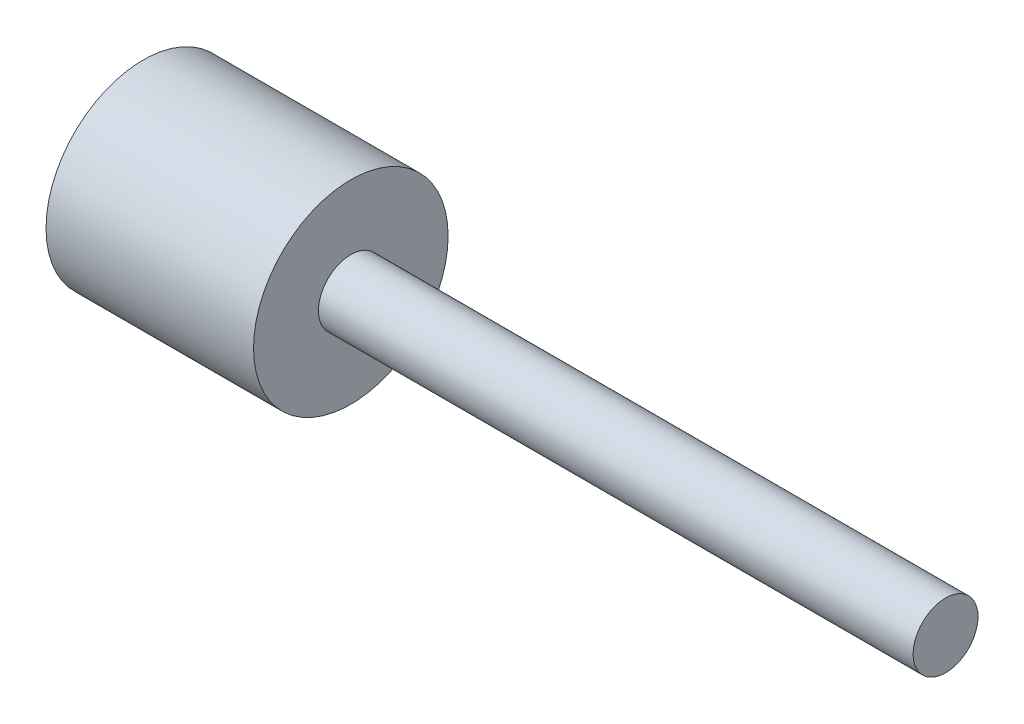
ISO-10303-21;
HEADER;
FILE_DESCRIPTION(('STEP AP214'),'2;1');
FILE_NAME('part.step','',(''),(''),'','','');
FILE_SCHEMA(('AUTOMOTIVE_DESIGN { 1 0 10303 214 1 1 1 1 }'));
ENDSEC;
DATA;
#1=APPLICATION_CONTEXT('core data for automotive mechanical design processes');
#2=APPLICATION_PROTOCOL_DEFINITION('international standard','automotive_design',2000,#1);
#3=PRODUCT_CONTEXT('',#1,'mechanical');
#4=PRODUCT('Part','Part','',(#3));
#5=PRODUCT_RELATED_PRODUCT_CATEGORY('part','',(#4));
#6=PRODUCT_DEFINITION_FORMATION('','',#4);
#7=PRODUCT_DEFINITION_CONTEXT('part definition',#1,'design');
#8=PRODUCT_DEFINITION('design','',#6,#7);
#9=PRODUCT_DEFINITION_SHAPE('','',#8);
#10=(LENGTH_UNIT() NAMED_UNIT(*) SI_UNIT(.MILLI.,.METRE.));
#11=(NAMED_UNIT(*) PLANE_ANGLE_UNIT() SI_UNIT($,.RADIAN.));
#12=(NAMED_UNIT(*) SI_UNIT($,.STERADIAN.) SOLID_ANGLE_UNIT());
#13=UNCERTAINTY_MEASURE_WITH_UNIT(LENGTH_MEASURE(1.E-05),#10,'distance_accuracy_value','');
#14=(GEOMETRIC_REPRESENTATION_CONTEXT(3) GLOBAL_UNCERTAINTY_ASSIGNED_CONTEXT((#13)) GLOBAL_UNIT_ASSIGNED_CONTEXT((#10,
#11,#12)) REPRESENTATION_CONTEXT('',''));
#15=CARTESIAN_POINT('',(0.,0.,0.));
#16=DIRECTION('',(0.,0.,1.));
#17=DIRECTION('',(1.,0.,0.));
#18=AXIS2_PLACEMENT_3D('',#15,#16,#17);
#19=CARTESIAN_POINT('',(16.,0.,0.));
#20=DIRECTION('',(-1.,0.,0.));
#21=DIRECTION('',(0.,0.,1.));
#22=AXIS2_PLACEMENT_3D('',#19,#20,#21);
#23=CYLINDRICAL_SURFACE('',#22,7.5);
#24=CARTESIAN_POINT('',(5.,-7.34846922834953,1.5));
#25=CARTESIAN_POINT('',(4.91665343676424,-7.34847088538349,1.49999691881235));
#26=CARTESIAN_POINT('',(4.83326806500025,-7.34990262402618,1.49302975757707));
#27=CARTESIAN_POINT('',(4.66885624228504,-7.35546646957746,1.46536842537441));
#28=CARTESIAN_POINT('',(4.58783173304596,-7.35960073717297,1.44466327060578));
#29=CARTESIAN_POINT('',(4.43054404496875,-7.37008310582665,1.39019367392958));
#30=CARTESIAN_POINT('',(4.35427621770114,-7.37642900431582,1.35644222122892));
#31=CARTESIAN_POINT('',(4.20848773295455,-7.39061699221019,1.27687366150577));
#32=CARTESIAN_POINT('',(4.13896669919314,-7.398458998102,1.23105722790173));
#33=CARTESIAN_POINT('',(4.00765849421921,-7.4148794954137,1.12796861348015));
#34=CARTESIAN_POINT('',(3.94598061817404,-7.42346606755867,1.07055848386998));
#35=CARTESIAN_POINT('',(3.83306369963153,-7.440337084539,0.946210183531966));
#36=CARTESIAN_POINT('',(3.78182538887421,-7.44862150816248,0.879271345466977));
#37=CARTESIAN_POINT('',(3.69081797355731,-7.46404194626342,0.737042033886384));
#38=CARTESIAN_POINT('',(3.65115272927504,-7.47116732162326,0.661683851508316));
#39=CARTESIAN_POINT('',(3.5850875944278,-7.48337605325447,0.505206225580907));
#40=CARTESIAN_POINT('',(3.55868646214851,-7.48845960066179,0.42408732213083));
#41=CARTESIAN_POINT('',(3.52023920957056,-7.49595481032628,0.259525159917742));
#42=CARTESIAN_POINT('',(3.50800853364349,-7.4984007943219,0.176126608822221));
#43=CARTESIAN_POINT('',(3.49767357224253,-7.50046381775405,0.00842785265630496));
#44=CARTESIAN_POINT('',(3.49956792553127,-7.50008112979138,-0.0758722647477643));
#45=CARTESIAN_POINT('',(3.51728927032333,-7.49655652302773,-0.241713001115383));
#46=CARTESIAN_POINT('',(3.53291746575177,-7.49345397548757,-0.323275821447705));
#47=CARTESIAN_POINT('',(3.57734754868834,-7.48488265739113,-0.482597439870451));
#48=CARTESIAN_POINT('',(3.60614996328781,-7.47941379216059,-0.560356085620693));
#49=CARTESIAN_POINT('',(3.6762950602209,-7.46665944029938,-0.71042919480133));
#50=CARTESIAN_POINT('',(3.71771562665733,-7.45936272262835,-0.78270626120085));
#51=CARTESIAN_POINT('',(3.8118636158549,-7.44375704210678,-0.919357568789634));
#52=CARTESIAN_POINT('',(3.86459233965578,-7.43544796282833,-0.983730899287501));
#53=CARTESIAN_POINT('',(3.98095043316271,-7.41856446546689,-1.10392714658019));
#54=CARTESIAN_POINT('',(4.04475378009439,-7.40998794686274,-1.15958147486045));
#55=CARTESIAN_POINT('',(4.18087466367613,-7.39367357398141,-1.25942773976521));
#56=CARTESIAN_POINT('',(4.25319236132479,-7.38593573556822,-1.30361945959163));
#57=CARTESIAN_POINT('',(4.40453124773271,-7.37217071209385,-1.37934422220282));
#58=CARTESIAN_POINT('',(4.48356645145949,-7.36614722345324,-1.41084997166656));
#59=CARTESIAN_POINT('',(4.64595698558599,-7.35654714481909,-1.46008551244137));
#60=CARTESIAN_POINT('',(4.72931175142863,-7.35297023592642,-1.47781709918496));
#61=CARTESIAN_POINT('',(4.89644728699857,-7.34873218901742,-1.49874900905408));
#62=CARTESIAN_POINT('',(4.98019636146551,-7.34802220585731,-1.50219278834687));
#63=CARTESIAN_POINT('',(5.14707233479953,-7.34946728533281,-1.49510644246611));
#64=CARTESIAN_POINT('',(5.2301992686783,-7.35162218550582,-1.48457710968366));
#65=CARTESIAN_POINT('',(5.39265296043835,-7.35850848742372,-1.45005331211123));
#66=CARTESIAN_POINT('',(5.47200851455364,-7.36321498521745,-1.42618893125895));
#67=CARTESIAN_POINT('',(5.62559491854311,-7.37465234027497,-1.36581155296278));
#68=CARTESIAN_POINT('',(5.69982534565358,-7.38138336429404,-1.32929751355976));
#69=CARTESIAN_POINT('',(5.84211966492524,-7.39622108943059,-1.2441062133234));
#70=CARTESIAN_POINT('',(5.91009056945124,-7.40434457797355,-1.19527661697413));
#71=CARTESIAN_POINT('',(6.03696246800137,-7.42100585739955,-1.08704335831907));
#72=CARTESIAN_POINT('',(6.09586252737388,-7.42954369085727,-1.02763860771681));
#73=CARTESIAN_POINT('',(6.20384383877836,-7.44623018803823,-0.898848410246836));
#74=CARTESIAN_POINT('',(6.25276048197499,-7.45437086563026,-0.829323748394444));
#75=CARTESIAN_POINT('',(6.33821882224937,-7.4692069144293,-0.682901844952133));
#76=CARTESIAN_POINT('',(6.37476103901717,-7.47590234632816,-0.60600491315026));
#77=CARTESIAN_POINT('',(6.43419330761995,-7.487059410916,-0.447454021236019));
#78=CARTESIAN_POINT('',(6.45716077733938,-7.49153368713906,-0.365830010217117));
#79=CARTESIAN_POINT('',(6.48903687149577,-7.4977985390649,-0.199784182019869));
#80=CARTESIAN_POINT('',(6.49794718921352,-7.49958943799765,-0.115362703066822));
#81=CARTESIAN_POINT('',(6.50139047144433,-7.50027810681181,0.0523093408554342));
#82=CARTESIAN_POINT('',(6.49617092068432,-7.49922567824026,0.135554718212252));
#83=CARTESIAN_POINT('',(6.47204907417828,-7.49445065340477,0.299956546973461));
#84=CARTESIAN_POINT('',(6.45314695047789,-7.49072809071528,0.381113024630536));
#85=CARTESIAN_POINT('',(6.40230651186253,-7.481032475475,0.538879124617643));
#86=CARTESIAN_POINT('',(6.37039793280322,-7.47506455871866,0.61549866486042));
#87=CARTESIAN_POINT('',(6.29448163800365,-7.46152083185077,0.762331830278928));
#88=CARTESIAN_POINT('',(6.25047296614443,-7.45394489468828,0.832544948651117));
#89=CARTESIAN_POINT('',(6.15077091940688,-7.43786398736791,0.965795835159535));
#90=CARTESIAN_POINT('',(6.09490049541984,-7.4293460013317,1.02869957417475));
#91=CARTESIAN_POINT('',(5.97342463985635,-7.41241834355477,1.14432392663527));
#92=CARTESIAN_POINT('',(5.90781690579693,-7.40400869794476,1.19704212480408));
#93=CARTESIAN_POINT('',(5.7678810249497,-7.3881501412478,1.29133832918279));
#94=CARTESIAN_POINT('',(5.69346655825931,-7.38071255446371,1.33279022195961));
#95=CARTESIAN_POINT('',(5.5386008400506,-7.36777855777287,1.40253607393175));
#96=CARTESIAN_POINT('',(5.45815514195366,-7.36228038807749,1.43084196896908));
#97=CARTESIAN_POINT('',(5.31460631684475,-7.3549452169166,1.4680037097813));
#98=CARTESIAN_POINT('',(5.25232187073151,-7.35253177367824,1.47998084778412));
#99=CARTESIAN_POINT('',(5.12669906817085,-7.34929317692711,1.49598002694097));
#100=CARTESIAN_POINT('',(5.06336074813256,-7.34846796865859,1.50000234234439));
#101=CARTESIAN_POINT('',(5.,-7.34846922834953,1.5));
#102=B_SPLINE_CURVE_WITH_KNOTS('',3,(#24,#25,#26,#27,#28,#29,#30,#31,#32,#33,#34,#35,#36,#37,
#38,#39,#40,#41,#42,#43,#44,#45,#46,#47,#48,#49,#50,#51,#52,#53,#54,#55,#56,#57,#58,#59,#60,#61,
#62,#63,#64,#65,#66,#67,#68,#69,#70,#71,#72,#73,#74,#75,#76,#77,#78,#79,#80,#81,#82,#83,#84,#85,
#86,#87,#88,#89,#90,#91,#92,#93,#94,#95,#96,#97,#98,#99,#100,#101),.UNSPECIFIED.,.T.,.F.,(4,2,2,
2,2,2,2,2,2,2,2,2,2,2,2,2,2,2,2,2,2,2,2,2,2,2,2,2,2,2,2,2,2,2,2,2,2,2,4),(0.,0.249807695804142,
0.499815358926445,0.749574746910878,0.999320197289795,1.25223378822655,1.50516510053133,
1.76030100656175,2.0154130236984,2.26716373324621,2.51889018174372,2.76703184450306,
3.01518343610625,3.26489886333455,3.51464303655099,3.76874020143725,4.0228421718408,
4.27748794759165,4.53210052524037,4.7823563670689,5.03259801792632,5.28044012674978,
5.52830265531597,5.77939589661781,6.03051499305313,6.28548902600176,6.54045234945157,
6.79394720367975,7.04741152037441,7.29646526122028,7.54551587050135,7.79400025613177,
8.04250428202026,8.29501728038395,8.54759008334671,8.80288347868561,9.05794462633398,
9.24785705455343,9.43776293526322),.UNSPECIFIED.);
#103=CARTESIAN_POINT('',(5.,-7.34846922834953,1.5));
#104=VERTEX_POINT('',#103);
#105=EDGE_CURVE('E85',#104,#104,#102,.T.);
#106=ORIENTED_EDGE('',*,*,#105,.F.);
#107=EDGE_LOOP('',(#106));
#108=FACE_BOUND('',#107,.T.);
#109=CARTESIAN_POINT('',(16.,0.,0.));
#110=DIRECTION('',(1.,0.,0.));
#111=DIRECTION('',(0.,0.,-1.));
#112=AXIS2_PLACEMENT_3D('',#109,#110,#111);
#113=CIRCLE('',#112,7.5);
#114=CARTESIAN_POINT('',(16.,0.,-7.5));
#115=VERTEX_POINT('',#114);
#116=EDGE_CURVE('E48',#115,#115,#113,.T.);
#117=ORIENTED_EDGE('',*,*,#116,.F.);
#118=EDGE_LOOP('',(#117));
#119=FACE_BOUND('',#118,.T.);
#120=CARTESIAN_POINT('',(0.,0.,0.));
#121=DIRECTION('',(1.,0.,0.));
#122=DIRECTION('',(0.,0.,-1.));
#123=AXIS2_PLACEMENT_3D('',#120,#121,#122);
#124=CIRCLE('',#123,7.5);
#125=CARTESIAN_POINT('',(0.,0.,-7.5));
#126=VERTEX_POINT('',#125);
#127=EDGE_CURVE('E42',#126,#126,#124,.T.);
#128=ORIENTED_EDGE('',*,*,#127,.T.);
#129=EDGE_LOOP('',(#128));
#130=FACE_BOUND('',#129,.T.);
#131=ADVANCED_FACE('F39',(#108,#119,#130),#23,.T.);
#132=CARTESIAN_POINT('',(16.,0.,0.));
#133=DIRECTION('',(1.,0.,0.));
#134=DIRECTION('',(0.,0.,-1.));
#135=AXIS2_PLACEMENT_3D('',#132,#133,#134);
#136=PLANE('',#135);
#137=CARTESIAN_POINT('',(16.,0.,0.));
#138=DIRECTION('',(1.,0.,0.));
#139=DIRECTION('',(0.,0.,-1.));
#140=AXIS2_PLACEMENT_3D('',#137,#138,#139);
#141=CIRCLE('',#140,2.5);
#142=CARTESIAN_POINT('',(16.,0.,-2.5));
#143=VERTEX_POINT('',#142);
#144=EDGE_CURVE('E11',#143,#143,#141,.T.);
#145=ORIENTED_EDGE('',*,*,#144,.F.);
#146=EDGE_LOOP('',(#145));
#147=FACE_BOUND('',#146,.T.);
#148=ORIENTED_EDGE('',*,*,#116,.T.);
#149=EDGE_LOOP('',(#148));
#150=FACE_BOUND('',#149,.T.);
#151=ADVANCED_FACE('F109',(#147,#150),#136,.T.);
#152=CARTESIAN_POINT('',(0.,0.,0.));
#153=DIRECTION('',(1.,0.,0.));
#154=DIRECTION('',(0.,0.,-1.));
#155=AXIS2_PLACEMENT_3D('',#152,#153,#154);
#156=PLANE('',#155);
#157=DIRECTION('',(0.,0.,1.));
#158=VECTOR('',#157,1.);
#159=CARTESIAN_POINT('',(0.,-2.5,-2.44948974278318));
#160=LINE('',#159,#158);
#161=CARTESIAN_POINT('',(0.,-2.5,-2.44948974278318));
#162=VERTEX_POINT('',#161);
#163=CARTESIAN_POINT('',(0.,-2.5,2.44948974278318));
#164=VERTEX_POINT('',#163);
#165=EDGE_CURVE('E77',#162,#164,#160,.T.);
#166=ORIENTED_EDGE('',*,*,#165,.F.);
#167=CARTESIAN_POINT('',(0.,0.,0.));
#168=DIRECTION('',(-1.,0.,0.));
#169=DIRECTION('',(0.,0.,1.));
#170=AXIS2_PLACEMENT_3D('',#167,#168,#169);
#171=CIRCLE('',#170,3.5);
#172=EDGE_CURVE('E56',#164,#162,#171,.T.);
#173=ORIENTED_EDGE('',*,*,#172,.F.);
#174=EDGE_LOOP('',(#166,#173));
#175=FACE_BOUND('',#174,.T.);
#176=ORIENTED_EDGE('',*,*,#127,.F.);
#177=EDGE_LOOP('',(#176));
#178=FACE_BOUND('',#177,.T.);
#179=ADVANCED_FACE('F82',(#175,#178),#156,.F.);
#180=CARTESIAN_POINT('',(61.85,0.,0.));
#181=DIRECTION('',(-1.,0.,0.));
#182=DIRECTION('',(0.,0.,1.));
#183=AXIS2_PLACEMENT_3D('',#180,#181,#182);
#184=CYLINDRICAL_SURFACE('',#183,2.5);
#185=CARTESIAN_POINT('',(61.85,0.,0.));
#186=DIRECTION('',(1.,0.,0.));
#187=DIRECTION('',(0.,0.,-1.));
#188=AXIS2_PLACEMENT_3D('',#185,#186,#187);
#189=CIRCLE('',#188,2.5);
#190=CARTESIAN_POINT('',(61.85,0.,-2.5));
#191=VERTEX_POINT('',#190);
#192=EDGE_CURVE('E73',#191,#191,#189,.T.);
#193=ORIENTED_EDGE('',*,*,#192,.F.);
#194=EDGE_LOOP('',(#193));
#195=FACE_BOUND('',#194,.T.);
#196=ORIENTED_EDGE('',*,*,#144,.T.);
#197=EDGE_LOOP('',(#196));
#198=FACE_BOUND('',#197,.T.);
#199=ADVANCED_FACE('F108',(#195,#198),#184,.T.);
#200=CARTESIAN_POINT('',(61.85,0.,0.));
#201=DIRECTION('',(1.,0.,0.));
#202=DIRECTION('',(0.,0.,-1.));
#203=AXIS2_PLACEMENT_3D('',#200,#201,#202);
#204=PLANE('',#203);
#205=ORIENTED_EDGE('',*,*,#192,.T.);
#206=EDGE_LOOP('',(#205));
#207=FACE_BOUND('',#206,.T.);
#208=ADVANCED_FACE('F114',(#207),#204,.T.);
#209=CARTESIAN_POINT('',(12.,0.,0.));
#210=DIRECTION('',(-1.,0.,0.));
#211=DIRECTION('',(0.,0.,1.));
#212=AXIS2_PLACEMENT_3D('',#209,#210,#211);
#213=CYLINDRICAL_SURFACE('',#212,3.5);
#214=ORIENTED_EDGE('',*,*,#172,.T.);
#215=DIRECTION('',(-1.,0.,0.));
#216=VECTOR('',#215,1.);
#217=CARTESIAN_POINT('',(12.,-2.5,-2.44948974278318));
#218=LINE('',#217,#216);
#219=CARTESIAN_POINT('',(12.,-2.5,-2.44948974278318));
#220=VERTEX_POINT('',#219);
#221=EDGE_CURVE('E74',#220,#162,#218,.T.);
#222=ORIENTED_EDGE('',*,*,#221,.F.);
#223=CARTESIAN_POINT('',(12.,0.,0.));
#224=DIRECTION('',(-1.,0.,0.));
#225=DIRECTION('',(0.,0.,1.));
#226=AXIS2_PLACEMENT_3D('',#223,#224,#225);
#227=CIRCLE('',#226,3.5);
#228=CARTESIAN_POINT('',(12.,-2.5,2.44948974278318));
#229=VERTEX_POINT('',#228);
#230=EDGE_CURVE('E70',#229,#220,#227,.T.);
#231=ORIENTED_EDGE('',*,*,#230,.F.);
#232=DIRECTION('',(-1.,0.,0.));
#233=VECTOR('',#232,1.);
#234=CARTESIAN_POINT('',(12.,-2.5,2.44948974278318));
#235=LINE('',#234,#233);
#236=EDGE_CURVE('E64',#229,#164,#235,.T.);
#237=ORIENTED_EDGE('',*,*,#236,.T.);
#238=EDGE_LOOP('',(#214,#222,#231,#237));
#239=FACE_BOUND('',#238,.T.);
#240=ADVANCED_FACE('F68',(#239),#213,.F.);
#241=CARTESIAN_POINT('',(12.,-2.5,-2.44948974278318));
#242=DIRECTION('',(0.,-1.,0.));
#243=DIRECTION('',(0.,0.,-1.));
#244=AXIS2_PLACEMENT_3D('',#241,#242,#243);
#245=PLANE('',#244);
#246=CARTESIAN_POINT('',(5.,-2.5,0.));
#247=DIRECTION('',(0.,1.,0.));
#248=DIRECTION('',(0.,0.,1.));
#249=AXIS2_PLACEMENT_3D('',#246,#247,#248);
#250=CIRCLE('',#249,1.5);
#251=CARTESIAN_POINT('',(5.,-2.5,1.5));
#252=VERTEX_POINT('',#251);
#253=EDGE_CURVE('E89',#252,#252,#250,.T.);
#254=ORIENTED_EDGE('',*,*,#253,.F.);
#255=EDGE_LOOP('',(#254));
#256=FACE_BOUND('',#255,.T.);
#257=ORIENTED_EDGE('',*,*,#165,.T.);
#258=ORIENTED_EDGE('',*,*,#236,.F.);
#259=DIRECTION('',(0.,0.,1.));
#260=VECTOR('',#259,1.);
#261=CARTESIAN_POINT('',(12.,-2.5,-2.44948974278318));
#262=LINE('',#261,#260);
#263=EDGE_CURVE('E92',#220,#229,#262,.T.);
#264=ORIENTED_EDGE('',*,*,#263,.F.);
#265=ORIENTED_EDGE('',*,*,#221,.T.);
#266=EDGE_LOOP('',(#257,#258,#264,#265));
#267=FACE_BOUND('',#266,.T.);
#268=ADVANCED_FACE('F78',(#256,#267),#245,.F.);
#269=CARTESIAN_POINT('',(12.,0.,0.));
#270=DIRECTION('',(-1.,0.,0.));
#271=DIRECTION('',(0.,0.,1.));
#272=AXIS2_PLACEMENT_3D('',#269,#270,#271);
#273=PLANE('',#272);
#274=ORIENTED_EDGE('',*,*,#230,.T.);
#275=ORIENTED_EDGE('',*,*,#263,.T.);
#276=EDGE_LOOP('',(#274,#275));
#277=FACE_BOUND('',#276,.T.);
#278=ADVANCED_FACE('F128',(#277),#273,.T.);
#279=CARTESIAN_POINT('',(5.,-7.501,0.));
#280=DIRECTION('',(0.,1.,0.));
#281=DIRECTION('',(0.,0.,1.));
#282=AXIS2_PLACEMENT_3D('',#279,#280,#281);
#283=CYLINDRICAL_SURFACE('',#282,1.5);
#284=ORIENTED_EDGE('',*,*,#253,.T.);
#285=EDGE_LOOP('',(#284));
#286=FACE_BOUND('',#285,.T.);
#287=ORIENTED_EDGE('',*,*,#105,.T.);
#288=EDGE_LOOP('',(#287));
#289=FACE_BOUND('',#288,.T.);
#290=ADVANCED_FACE('F126',(#286,#289),#283,.F.);
#291=CLOSED_SHELL('',(#131,#151,#179,#199,#208,#240,#268,#278,#290));
#292=MANIFOLD_SOLID_BREP('B2',#291);
#293=ADVANCED_BREP_SHAPE_REPRESENTATION('',(#18,#292),#14);
#294=SHAPE_DEFINITION_REPRESENTATION(#9,#293);
ENDSEC;
END-ISO-10303-21;
